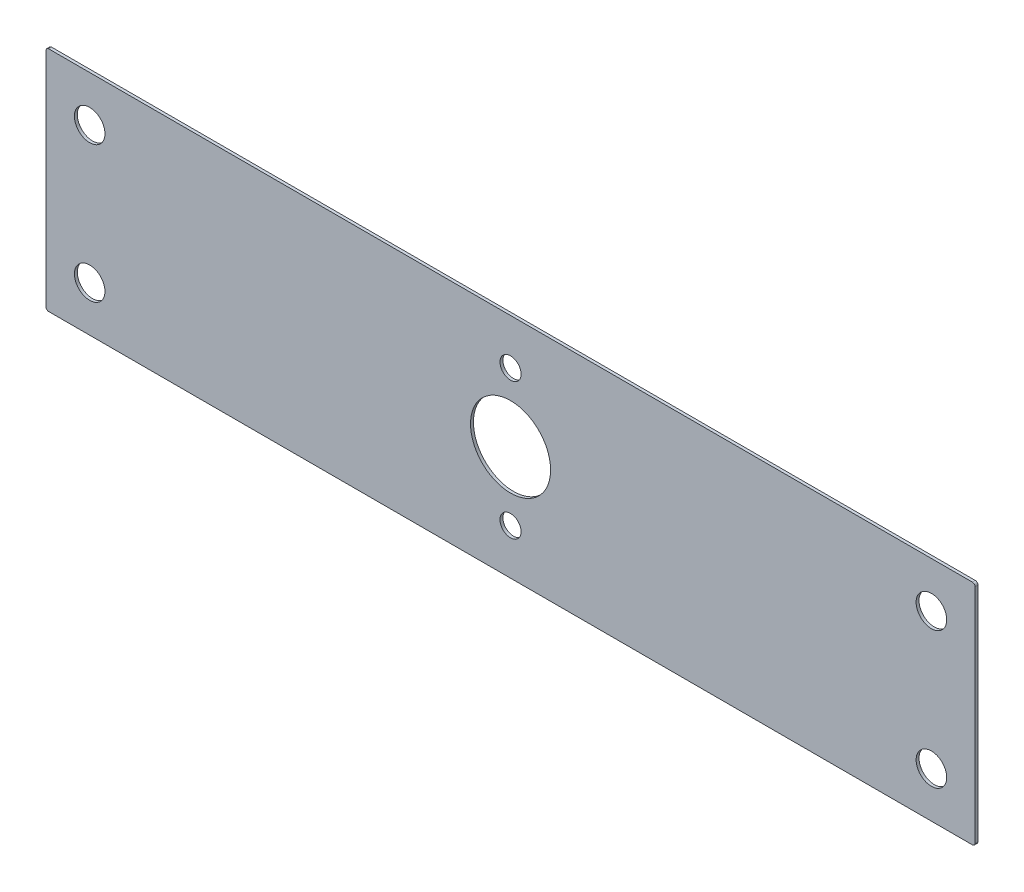
ISO-10303-21;
HEADER;
FILE_DESCRIPTION(('STEP AP214'),'2;1');
FILE_NAME('part.step','',(''),(''),'','','');
FILE_SCHEMA(('AUTOMOTIVE_DESIGN { 1 0 10303 214 1 1 1 1 }'));
ENDSEC;
DATA;
#1=APPLICATION_CONTEXT('core data for automotive mechanical design processes');
#2=APPLICATION_PROTOCOL_DEFINITION('international standard','automotive_design',2000,#1);
#3=PRODUCT_CONTEXT('',#1,'mechanical');
#4=PRODUCT('Part','Part','',(#3));
#5=PRODUCT_RELATED_PRODUCT_CATEGORY('part','',(#4));
#6=PRODUCT_DEFINITION_FORMATION('','',#4);
#7=PRODUCT_DEFINITION_CONTEXT('part definition',#1,'design');
#8=PRODUCT_DEFINITION('design','',#6,#7);
#9=PRODUCT_DEFINITION_SHAPE('','',#8);
#10=(LENGTH_UNIT() NAMED_UNIT(*) SI_UNIT(.MILLI.,.METRE.));
#11=(NAMED_UNIT(*) PLANE_ANGLE_UNIT() SI_UNIT($,.RADIAN.));
#12=(NAMED_UNIT(*) SI_UNIT($,.STERADIAN.) SOLID_ANGLE_UNIT());
#13=UNCERTAINTY_MEASURE_WITH_UNIT(LENGTH_MEASURE(1.E-05),#10,'distance_accuracy_value','');
#14=(GEOMETRIC_REPRESENTATION_CONTEXT(3) GLOBAL_UNCERTAINTY_ASSIGNED_CONTEXT((#13)) GLOBAL_UNIT_ASSIGNED_CONTEXT((#10,
#11,#12)) REPRESENTATION_CONTEXT('',''));
#15=CARTESIAN_POINT('',(0.,0.,0.));
#16=DIRECTION('',(0.,0.,1.));
#17=DIRECTION('',(1.,0.,0.));
#18=AXIS2_PLACEMENT_3D('',#15,#16,#17);
#19=CARTESIAN_POINT('',(0.,0.,0.4064));
#20=DIRECTION('',(0.,0.,1.));
#21=DIRECTION('',(1.,0.,0.));
#22=AXIS2_PLACEMENT_3D('',#19,#20,#21);
#23=PLANE('',#22);
#24=CARTESIAN_POINT('',(-58.7248,9.525,0.4064));
#25=DIRECTION('',(0.,0.,1.));
#26=DIRECTION('',(1.,0.,0.));
#27=AXIS2_PLACEMENT_3D('',#24,#25,#26);
#28=CIRCLE('',#27,2.1336);
#29=CARTESIAN_POINT('',(-56.5912,9.525,0.4064));
#30=VERTEX_POINT('',#29);
#31=EDGE_CURVE('E409',#30,#30,#28,.T.);
#32=ORIENTED_EDGE('',*,*,#31,.F.);
#33=EDGE_LOOP('',(#32));
#34=FACE_BOUND('',#33,.T.);
#35=CARTESIAN_POINT('',(0.,9.525,0.4064));
#36=DIRECTION('',(0.,0.,1.));
#37=DIRECTION('',(1.,0.,0.));
#38=AXIS2_PLACEMENT_3D('',#35,#36,#37);
#39=CIRCLE('',#38,1.4732);
#40=CARTESIAN_POINT('',(1.4732,9.525,0.4064));
#41=VERTEX_POINT('',#40);
#42=EDGE_CURVE('E169',#41,#41,#39,.T.);
#43=ORIENTED_EDGE('',*,*,#42,.F.);
#44=EDGE_LOOP('',(#43));
#45=FACE_BOUND('',#44,.T.);
#46=CARTESIAN_POINT('',(58.7248,-9.525,0.4064));
#47=DIRECTION('',(0.,0.,1.));
#48=DIRECTION('',(1.,0.,0.));
#49=AXIS2_PLACEMENT_3D('',#46,#47,#48);
#50=CIRCLE('',#49,2.1336);
#51=CARTESIAN_POINT('',(60.8584,-9.525,0.4064));
#52=VERTEX_POINT('',#51);
#53=EDGE_CURVE('E188',#52,#52,#50,.T.);
#54=ORIENTED_EDGE('',*,*,#53,.F.);
#55=EDGE_LOOP('',(#54));
#56=FACE_BOUND('',#55,.T.);
#57=DIRECTION('',(-1.,0.,0.));
#58=VECTOR('',#57,1.);
#59=CARTESIAN_POINT('',(-64.8208,15.875,0.4064));
#60=LINE('',#59,#58);
#61=CARTESIAN_POINT('',(64.4398,15.875,0.4064));
#62=VERTEX_POINT('',#61);
#63=CARTESIAN_POINT('',(-64.4398,15.875,0.4064));
#64=VERTEX_POINT('',#63);
#65=EDGE_CURVE('E143',#62,#64,#60,.T.);
#66=ORIENTED_EDGE('',*,*,#65,.T.);
#67=CARTESIAN_POINT('',(-64.4398,15.494,0.4064));
#68=DIRECTION('',(0.,0.,1.));
#69=DIRECTION('',(1.,0.,0.));
#70=AXIS2_PLACEMENT_3D('',#67,#68,#69);
#71=CIRCLE('',#70,0.381);
#72=CARTESIAN_POINT('',(-64.8208,15.494,0.4064));
#73=VERTEX_POINT('',#72);
#74=EDGE_CURVE('E214',#64,#73,#71,.T.);
#75=ORIENTED_EDGE('',*,*,#74,.T.);
#76=DIRECTION('',(0.,-1.,0.));
#77=VECTOR('',#76,1.);
#78=CARTESIAN_POINT('',(-64.8208,15.875,0.4064));
#79=LINE('',#78,#77);
#80=CARTESIAN_POINT('',(-64.8208,-15.494,0.4064));
#81=VERTEX_POINT('',#80);
#82=EDGE_CURVE('E125',#73,#81,#79,.T.);
#83=ORIENTED_EDGE('',*,*,#82,.T.);
#84=CARTESIAN_POINT('',(-64.4398,-15.494,0.4064));
#85=DIRECTION('',(0.,0.,1.));
#86=DIRECTION('',(1.,0.,0.));
#87=AXIS2_PLACEMENT_3D('',#84,#85,#86);
#88=CIRCLE('',#87,0.381);
#89=CARTESIAN_POINT('',(-64.4398,-15.875,0.4064));
#90=VERTEX_POINT('',#89);
#91=EDGE_CURVE('E212',#81,#90,#88,.T.);
#92=ORIENTED_EDGE('',*,*,#91,.T.);
#93=DIRECTION('',(1.,0.,0.));
#94=VECTOR('',#93,1.);
#95=CARTESIAN_POINT('',(-64.8208,-15.875,0.4064));
#96=LINE('',#95,#94);
#97=CARTESIAN_POINT('',(64.4398,-15.875,0.4064));
#98=VERTEX_POINT('',#97);
#99=EDGE_CURVE('E206',#90,#98,#96,.T.);
#100=ORIENTED_EDGE('',*,*,#99,.T.);
#101=CARTESIAN_POINT('',(64.4398,-15.494,0.4064));
#102=DIRECTION('',(0.,0.,1.));
#103=DIRECTION('',(1.,0.,0.));
#104=AXIS2_PLACEMENT_3D('',#101,#102,#103);
#105=CIRCLE('',#104,0.381);
#106=CARTESIAN_POINT('',(64.8208,-15.494,0.4064));
#107=VERTEX_POINT('',#106);
#108=EDGE_CURVE('E60',#98,#107,#105,.T.);
#109=ORIENTED_EDGE('',*,*,#108,.T.);
#110=DIRECTION('',(0.,1.,0.));
#111=VECTOR('',#110,1.);
#112=CARTESIAN_POINT('',(64.8208,15.875,0.4064));
#113=LINE('',#112,#111);
#114=CARTESIAN_POINT('',(64.8208,15.494,0.4064));
#115=VERTEX_POINT('',#114);
#116=EDGE_CURVE('E233',#107,#115,#113,.T.);
#117=ORIENTED_EDGE('',*,*,#116,.T.);
#118=CARTESIAN_POINT('',(64.4398,15.494,0.4064));
#119=DIRECTION('',(0.,0.,1.));
#120=DIRECTION('',(1.,0.,0.));
#121=AXIS2_PLACEMENT_3D('',#118,#119,#120);
#122=CIRCLE('',#121,0.381);
#123=EDGE_CURVE('E158',#115,#62,#122,.T.);
#124=ORIENTED_EDGE('',*,*,#123,.T.);
#125=EDGE_LOOP('',(#66,#75,#83,#92,#100,#109,#117,#124));
#126=FACE_BOUND('',#125,.T.);
#127=CARTESIAN_POINT('',(58.7248,9.525,0.4064));
#128=DIRECTION('',(0.,0.,1.));
#129=DIRECTION('',(1.,0.,0.));
#130=AXIS2_PLACEMENT_3D('',#127,#128,#129);
#131=CIRCLE('',#130,2.1336);
#132=CARTESIAN_POINT('',(60.8584,9.525,0.4064));
#133=VERTEX_POINT('',#132);
#134=EDGE_CURVE('E133',#133,#133,#131,.T.);
#135=ORIENTED_EDGE('',*,*,#134,.F.);
#136=EDGE_LOOP('',(#135));
#137=FACE_BOUND('',#136,.T.);
#138=CARTESIAN_POINT('',(0.,0.,0.4064));
#139=DIRECTION('',(0.,0.,1.));
#140=DIRECTION('',(1.,0.,0.));
#141=AXIS2_PLACEMENT_3D('',#138,#139,#140);
#142=CIRCLE('',#141,5.588);
#143=CARTESIAN_POINT('',(5.588,0.,0.4064));
#144=VERTEX_POINT('',#143);
#145=EDGE_CURVE('E180',#144,#144,#142,.T.);
#146=ORIENTED_EDGE('',*,*,#145,.F.);
#147=EDGE_LOOP('',(#146));
#148=FACE_BOUND('',#147,.T.);
#149=CARTESIAN_POINT('',(0.,-9.525,0.4064));
#150=DIRECTION('',(0.,0.,1.));
#151=DIRECTION('',(1.,0.,0.));
#152=AXIS2_PLACEMENT_3D('',#149,#150,#151);
#153=CIRCLE('',#152,1.4732);
#154=CARTESIAN_POINT('',(1.4732,-9.525,0.4064));
#155=VERTEX_POINT('',#154);
#156=EDGE_CURVE('E179',#155,#155,#153,.T.);
#157=ORIENTED_EDGE('',*,*,#156,.F.);
#158=EDGE_LOOP('',(#157));
#159=FACE_BOUND('',#158,.T.);
#160=CARTESIAN_POINT('',(-58.7248,-9.525,0.4064));
#161=DIRECTION('',(0.,0.,1.));
#162=DIRECTION('',(1.,0.,0.));
#163=AXIS2_PLACEMENT_3D('',#160,#161,#162);
#164=CIRCLE('',#163,2.1336);
#165=CARTESIAN_POINT('',(-56.5912,-9.525,0.4064));
#166=VERTEX_POINT('',#165);
#167=EDGE_CURVE('E416',#166,#166,#164,.T.);
#168=ORIENTED_EDGE('',*,*,#167,.F.);
#169=EDGE_LOOP('',(#168));
#170=FACE_BOUND('',#169,.T.);
#171=ADVANCED_FACE('F39',(#34,#45,#56,#126,#137,#148,#159,#170),#23,.T.);
#172=CARTESIAN_POINT('',(0.,0.,0.));
#173=DIRECTION('',(0.,0.,1.));
#174=DIRECTION('',(1.,0.,0.));
#175=AXIS2_PLACEMENT_3D('',#172,#173,#174);
#176=PLANE('',#175);
#177=CARTESIAN_POINT('',(-58.7248,9.525,0.));
#178=DIRECTION('',(0.,0.,1.));
#179=DIRECTION('',(1.,0.,0.));
#180=AXIS2_PLACEMENT_3D('',#177,#178,#179);
#181=CIRCLE('',#180,2.1336);
#182=CARTESIAN_POINT('',(-56.5912,9.525,0.));
#183=VERTEX_POINT('',#182);
#184=EDGE_CURVE('E412',#183,#183,#181,.T.);
#185=ORIENTED_EDGE('',*,*,#184,.T.);
#186=EDGE_LOOP('',(#185));
#187=FACE_BOUND('',#186,.T.);
#188=CARTESIAN_POINT('',(0.,9.525,0.));
#189=DIRECTION('',(0.,0.,1.));
#190=DIRECTION('',(1.,0.,0.));
#191=AXIS2_PLACEMENT_3D('',#188,#189,#190);
#192=CIRCLE('',#191,1.4732);
#193=CARTESIAN_POINT('',(1.4732,9.525,0.));
#194=VERTEX_POINT('',#193);
#195=EDGE_CURVE('E176',#194,#194,#192,.T.);
#196=ORIENTED_EDGE('',*,*,#195,.T.);
#197=EDGE_LOOP('',(#196));
#198=FACE_BOUND('',#197,.T.);
#199=CARTESIAN_POINT('',(58.7248,-9.525,0.));
#200=DIRECTION('',(0.,0.,1.));
#201=DIRECTION('',(1.,0.,0.));
#202=AXIS2_PLACEMENT_3D('',#199,#200,#201);
#203=CIRCLE('',#202,2.1336);
#204=CARTESIAN_POINT('',(60.8584,-9.525,0.));
#205=VERTEX_POINT('',#204);
#206=EDGE_CURVE('E185',#205,#205,#203,.T.);
#207=ORIENTED_EDGE('',*,*,#206,.T.);
#208=EDGE_LOOP('',(#207));
#209=FACE_BOUND('',#208,.T.);
#210=DIRECTION('',(0.,-1.,0.));
#211=VECTOR('',#210,1.);
#212=CARTESIAN_POINT('',(-64.8208,15.875,0.));
#213=LINE('',#212,#211);
#214=CARTESIAN_POINT('',(-64.8208,15.494,0.));
#215=VERTEX_POINT('',#214);
#216=CARTESIAN_POINT('',(-64.8208,-15.494,0.));
#217=VERTEX_POINT('',#216);
#218=EDGE_CURVE('E122',#215,#217,#213,.T.);
#219=ORIENTED_EDGE('',*,*,#218,.F.);
#220=CARTESIAN_POINT('',(-64.4398,15.494,0.));
#221=DIRECTION('',(0.,0.,1.));
#222=DIRECTION('',(1.,0.,0.));
#223=AXIS2_PLACEMENT_3D('',#220,#221,#222);
#224=CIRCLE('',#223,0.381);
#225=CARTESIAN_POINT('',(-64.4398,15.875,0.));
#226=VERTEX_POINT('',#225);
#227=EDGE_CURVE('E105',#215,#226,#224,.F.);
#228=ORIENTED_EDGE('',*,*,#227,.T.);
#229=DIRECTION('',(-1.,0.,0.));
#230=VECTOR('',#229,1.);
#231=CARTESIAN_POINT('',(-64.8208,15.875,0.));
#232=LINE('',#231,#230);
#233=CARTESIAN_POINT('',(64.4398,15.875,0.));
#234=VERTEX_POINT('',#233);
#235=EDGE_CURVE('E148',#234,#226,#232,.T.);
#236=ORIENTED_EDGE('',*,*,#235,.F.);
#237=CARTESIAN_POINT('',(64.4398,15.494,0.));
#238=DIRECTION('',(0.,0.,1.));
#239=DIRECTION('',(1.,0.,0.));
#240=AXIS2_PLACEMENT_3D('',#237,#238,#239);
#241=CIRCLE('',#240,0.381);
#242=CARTESIAN_POINT('',(64.8208,15.494,0.));
#243=VERTEX_POINT('',#242);
#244=EDGE_CURVE('E126',#234,#243,#241,.F.);
#245=ORIENTED_EDGE('',*,*,#244,.T.);
#246=DIRECTION('',(0.,1.,0.));
#247=VECTOR('',#246,1.);
#248=CARTESIAN_POINT('',(64.8208,15.875,0.));
#249=LINE('',#248,#247);
#250=CARTESIAN_POINT('',(64.8208,-15.494,0.));
#251=VERTEX_POINT('',#250);
#252=EDGE_CURVE('E136',#251,#243,#249,.T.);
#253=ORIENTED_EDGE('',*,*,#252,.F.);
#254=CARTESIAN_POINT('',(64.4398,-15.494,0.));
#255=DIRECTION('',(0.,0.,1.));
#256=DIRECTION('',(1.,0.,0.));
#257=AXIS2_PLACEMENT_3D('',#254,#255,#256);
#258=CIRCLE('',#257,0.381);
#259=CARTESIAN_POINT('',(64.4398,-15.875,0.));
#260=VERTEX_POINT('',#259);
#261=EDGE_CURVE('E152',#251,#260,#258,.F.);
#262=ORIENTED_EDGE('',*,*,#261,.T.);
#263=DIRECTION('',(1.,0.,0.));
#264=VECTOR('',#263,1.);
#265=CARTESIAN_POINT('',(-64.8208,-15.875,0.));
#266=LINE('',#265,#264);
#267=CARTESIAN_POINT('',(-64.4398,-15.875,0.));
#268=VERTEX_POINT('',#267);
#269=EDGE_CURVE('E132',#268,#260,#266,.T.);
#270=ORIENTED_EDGE('',*,*,#269,.F.);
#271=CARTESIAN_POINT('',(-64.4398,-15.494,0.));
#272=DIRECTION('',(0.,0.,1.));
#273=DIRECTION('',(1.,0.,0.));
#274=AXIS2_PLACEMENT_3D('',#271,#272,#273);
#275=CIRCLE('',#274,0.381);
#276=EDGE_CURVE('E116',#268,#217,#275,.F.);
#277=ORIENTED_EDGE('',*,*,#276,.T.);
#278=EDGE_LOOP('',(#219,#228,#236,#245,#253,#262,#270,#277));
#279=FACE_BOUND('',#278,.T.);
#280=CARTESIAN_POINT('',(58.7248,9.525,0.));
#281=DIRECTION('',(0.,0.,1.));
#282=DIRECTION('',(1.,0.,0.));
#283=AXIS2_PLACEMENT_3D('',#280,#281,#282);
#284=CIRCLE('',#283,2.1336);
#285=CARTESIAN_POINT('',(60.8584,9.525,0.));
#286=VERTEX_POINT('',#285);
#287=EDGE_CURVE('E140',#286,#286,#284,.T.);
#288=ORIENTED_EDGE('',*,*,#287,.T.);
#289=EDGE_LOOP('',(#288));
#290=FACE_BOUND('',#289,.T.);
#291=CARTESIAN_POINT('',(0.,0.,0.));
#292=DIRECTION('',(0.,0.,1.));
#293=DIRECTION('',(1.,0.,0.));
#294=AXIS2_PLACEMENT_3D('',#291,#292,#293);
#295=CIRCLE('',#294,5.588);
#296=CARTESIAN_POINT('',(5.588,0.,0.));
#297=VERTEX_POINT('',#296);
#298=EDGE_CURVE('E175',#297,#297,#295,.T.);
#299=ORIENTED_EDGE('',*,*,#298,.T.);
#300=EDGE_LOOP('',(#299));
#301=FACE_BOUND('',#300,.T.);
#302=CARTESIAN_POINT('',(0.,-9.525,0.));
#303=DIRECTION('',(0.,0.,1.));
#304=DIRECTION('',(1.,0.,0.));
#305=AXIS2_PLACEMENT_3D('',#302,#303,#304);
#306=CIRCLE('',#305,1.4732);
#307=CARTESIAN_POINT('',(1.4732,-9.525,0.));
#308=VERTEX_POINT('',#307);
#309=EDGE_CURVE('E177',#308,#308,#306,.T.);
#310=ORIENTED_EDGE('',*,*,#309,.T.);
#311=EDGE_LOOP('',(#310));
#312=FACE_BOUND('',#311,.T.);
#313=CARTESIAN_POINT('',(-58.7248,-9.525,0.));
#314=DIRECTION('',(0.,0.,1.));
#315=DIRECTION('',(1.,0.,0.));
#316=AXIS2_PLACEMENT_3D('',#313,#314,#315);
#317=CIRCLE('',#316,2.1336);
#318=CARTESIAN_POINT('',(-56.5912,-9.525,0.));
#319=VERTEX_POINT('',#318);
#320=EDGE_CURVE('E420',#319,#319,#317,.T.);
#321=ORIENTED_EDGE('',*,*,#320,.T.);
#322=EDGE_LOOP('',(#321));
#323=FACE_BOUND('',#322,.T.);
#324=ADVANCED_FACE('F129',(#187,#198,#209,#279,#290,#301,#312,#323),#176,.F.);
#325=CARTESIAN_POINT('',(-64.8208,15.875,0.4064));
#326=DIRECTION('',(1.,0.,0.));
#327=DIRECTION('',(0.,0.,-1.));
#328=AXIS2_PLACEMENT_3D('',#325,#326,#327);
#329=PLANE('',#328);
#330=ORIENTED_EDGE('',*,*,#82,.F.);
#331=DIRECTION('',(0.,0.,-1.));
#332=VECTOR('',#331,1.);
#333=CARTESIAN_POINT('',(-64.8208,15.494,0.4064));
#334=LINE('',#333,#332);
#335=EDGE_CURVE('E109',#73,#215,#334,.T.);
#336=ORIENTED_EDGE('',*,*,#335,.T.);
#337=ORIENTED_EDGE('',*,*,#218,.T.);
#338=DIRECTION('',(0.,0.,-1.));
#339=VECTOR('',#338,1.);
#340=CARTESIAN_POINT('',(-64.8208,-15.494,0.4064));
#341=LINE('',#340,#339);
#342=EDGE_CURVE('E127',#217,#81,#341,.F.);
#343=ORIENTED_EDGE('',*,*,#342,.T.);
#344=EDGE_LOOP('',(#330,#336,#337,#343));
#345=FACE_BOUND('',#344,.T.);
#346=ADVANCED_FACE('F121',(#345),#329,.F.);
#347=CARTESIAN_POINT('',(-64.8208,-15.875,0.4064));
#348=DIRECTION('',(0.,1.,0.));
#349=DIRECTION('',(0.,0.,1.));
#350=AXIS2_PLACEMENT_3D('',#347,#348,#349);
#351=PLANE('',#350);
#352=ORIENTED_EDGE('',*,*,#99,.F.);
#353=DIRECTION('',(0.,0.,-1.));
#354=VECTOR('',#353,1.);
#355=CARTESIAN_POINT('',(-64.4398,-15.875,0.4064));
#356=LINE('',#355,#354);
#357=EDGE_CURVE('E219',#90,#268,#356,.T.);
#358=ORIENTED_EDGE('',*,*,#357,.T.);
#359=ORIENTED_EDGE('',*,*,#269,.T.);
#360=DIRECTION('',(0.,0.,-1.));
#361=VECTOR('',#360,1.);
#362=CARTESIAN_POINT('',(64.4398,-15.875,0.4064));
#363=LINE('',#362,#361);
#364=EDGE_CURVE('E217',#260,#98,#363,.F.);
#365=ORIENTED_EDGE('',*,*,#364,.T.);
#366=EDGE_LOOP('',(#352,#358,#359,#365));
#367=FACE_BOUND('',#366,.T.);
#368=ADVANCED_FACE('F224',(#367),#351,.F.);
#369=CARTESIAN_POINT('',(64.8208,15.875,0.4064));
#370=DIRECTION('',(-1.,0.,0.));
#371=DIRECTION('',(0.,0.,1.));
#372=AXIS2_PLACEMENT_3D('',#369,#370,#371);
#373=PLANE('',#372);
#374=ORIENTED_EDGE('',*,*,#116,.F.);
#375=DIRECTION('',(0.,0.,-1.));
#376=VECTOR('',#375,1.);
#377=CARTESIAN_POINT('',(64.8208,-15.494,0.4064));
#378=LINE('',#377,#376);
#379=EDGE_CURVE('E12',#107,#251,#378,.T.);
#380=ORIENTED_EDGE('',*,*,#379,.T.);
#381=ORIENTED_EDGE('',*,*,#252,.T.);
#382=DIRECTION('',(0.,0.,-1.));
#383=VECTOR('',#382,1.);
#384=CARTESIAN_POINT('',(64.8208,15.494,0.4064));
#385=LINE('',#384,#383);
#386=EDGE_CURVE('E47',#243,#115,#385,.F.);
#387=ORIENTED_EDGE('',*,*,#386,.T.);
#388=EDGE_LOOP('',(#374,#380,#381,#387));
#389=FACE_BOUND('',#388,.T.);
#390=ADVANCED_FACE('F232',(#389),#373,.F.);
#391=CARTESIAN_POINT('',(-64.8208,15.875,0.4064));
#392=DIRECTION('',(0.,-1.,0.));
#393=DIRECTION('',(0.,0.,-1.));
#394=AXIS2_PLACEMENT_3D('',#391,#392,#393);
#395=PLANE('',#394);
#396=ORIENTED_EDGE('',*,*,#235,.T.);
#397=DIRECTION('',(0.,0.,-1.));
#398=VECTOR('',#397,1.);
#399=CARTESIAN_POINT('',(-64.4398,15.875,0.4064));
#400=LINE('',#399,#398);
#401=EDGE_CURVE('E110',#226,#64,#400,.F.);
#402=ORIENTED_EDGE('',*,*,#401,.T.);
#403=ORIENTED_EDGE('',*,*,#65,.F.);
#404=DIRECTION('',(0.,0.,-1.));
#405=VECTOR('',#404,1.);
#406=CARTESIAN_POINT('',(64.4398,15.875,0.4064));
#407=LINE('',#406,#405);
#408=EDGE_CURVE('E115',#62,#234,#407,.T.);
#409=ORIENTED_EDGE('',*,*,#408,.T.);
#410=EDGE_LOOP('',(#396,#402,#403,#409));
#411=FACE_BOUND('',#410,.T.);
#412=ADVANCED_FACE('F262',(#411),#395,.F.);
#413=CARTESIAN_POINT('',(58.7248,9.525,0.4064));
#414=DIRECTION('',(0.,0.,-1.));
#415=DIRECTION('',(-1.,0.,0.));
#416=AXIS2_PLACEMENT_3D('',#413,#414,#415);
#417=CYLINDRICAL_SURFACE('',#416,2.1336);
#418=ORIENTED_EDGE('',*,*,#134,.T.);
#419=EDGE_LOOP('',(#418));
#420=FACE_BOUND('',#419,.T.);
#421=ORIENTED_EDGE('',*,*,#287,.F.);
#422=EDGE_LOOP('',(#421));
#423=FACE_BOUND('',#422,.T.);
#424=ADVANCED_FACE('F259',(#420,#423),#417,.F.);
#425=CARTESIAN_POINT('',(58.7248,-9.525,0.4064));
#426=DIRECTION('',(0.,0.,-1.));
#427=DIRECTION('',(-1.,0.,0.));
#428=AXIS2_PLACEMENT_3D('',#425,#426,#427);
#429=CYLINDRICAL_SURFACE('',#428,2.1336);
#430=ORIENTED_EDGE('',*,*,#53,.T.);
#431=EDGE_LOOP('',(#430));
#432=FACE_BOUND('',#431,.T.);
#433=ORIENTED_EDGE('',*,*,#206,.F.);
#434=EDGE_LOOP('',(#433));
#435=FACE_BOUND('',#434,.T.);
#436=ADVANCED_FACE('F294',(#432,#435),#429,.F.);
#437=CARTESIAN_POINT('',(0.,0.,0.4064));
#438=DIRECTION('',(0.,0.,-1.));
#439=DIRECTION('',(-1.,0.,0.));
#440=AXIS2_PLACEMENT_3D('',#437,#438,#439);
#441=CYLINDRICAL_SURFACE('',#440,5.588);
#442=ORIENTED_EDGE('',*,*,#145,.T.);
#443=EDGE_LOOP('',(#442));
#444=FACE_BOUND('',#443,.T.);
#445=ORIENTED_EDGE('',*,*,#298,.F.);
#446=EDGE_LOOP('',(#445));
#447=FACE_BOUND('',#446,.T.);
#448=ADVANCED_FACE('F301',(#444,#447),#441,.F.);
#449=CARTESIAN_POINT('',(0.,9.525,0.4064));
#450=DIRECTION('',(0.,0.,-1.));
#451=DIRECTION('',(-1.,0.,0.));
#452=AXIS2_PLACEMENT_3D('',#449,#450,#451);
#453=CYLINDRICAL_SURFACE('',#452,1.4732);
#454=ORIENTED_EDGE('',*,*,#42,.T.);
#455=EDGE_LOOP('',(#454));
#456=FACE_BOUND('',#455,.T.);
#457=ORIENTED_EDGE('',*,*,#195,.F.);
#458=EDGE_LOOP('',(#457));
#459=FACE_BOUND('',#458,.T.);
#460=ADVANCED_FACE('F308',(#456,#459),#453,.F.);
#461=CARTESIAN_POINT('',(0.,-9.525,0.4064));
#462=DIRECTION('',(0.,0.,-1.));
#463=DIRECTION('',(-1.,0.,0.));
#464=AXIS2_PLACEMENT_3D('',#461,#462,#463);
#465=CYLINDRICAL_SURFACE('',#464,1.4732);
#466=ORIENTED_EDGE('',*,*,#156,.T.);
#467=EDGE_LOOP('',(#466));
#468=FACE_BOUND('',#467,.T.);
#469=ORIENTED_EDGE('',*,*,#309,.F.);
#470=EDGE_LOOP('',(#469));
#471=FACE_BOUND('',#470,.T.);
#472=ADVANCED_FACE('F316',(#468,#471),#465,.F.);
#473=CARTESIAN_POINT('',(-58.7248,9.525,0.4064));
#474=DIRECTION('',(0.,0.,-1.));
#475=DIRECTION('',(-1.,0.,0.));
#476=AXIS2_PLACEMENT_3D('',#473,#474,#475);
#477=CYLINDRICAL_SURFACE('',#476,2.1336);
#478=ORIENTED_EDGE('',*,*,#31,.T.);
#479=EDGE_LOOP('',(#478));
#480=FACE_BOUND('',#479,.T.);
#481=ORIENTED_EDGE('',*,*,#184,.F.);
#482=EDGE_LOOP('',(#481));
#483=FACE_BOUND('',#482,.T.);
#484=ADVANCED_FACE('F324',(#480,#483),#477,.F.);
#485=CARTESIAN_POINT('',(-58.7248,-9.525,0.4064));
#486=DIRECTION('',(0.,0.,-1.));
#487=DIRECTION('',(-1.,0.,0.));
#488=AXIS2_PLACEMENT_3D('',#485,#486,#487);
#489=CYLINDRICAL_SURFACE('',#488,2.1336);
#490=ORIENTED_EDGE('',*,*,#167,.T.);
#491=EDGE_LOOP('',(#490));
#492=FACE_BOUND('',#491,.T.);
#493=ORIENTED_EDGE('',*,*,#320,.F.);
#494=EDGE_LOOP('',(#493));
#495=FACE_BOUND('',#494,.T.);
#496=ADVANCED_FACE('F246',(#492,#495),#489,.F.);
#497=CARTESIAN_POINT('',(-64.4398,15.494,0.4064));
#498=DIRECTION('',(0.,0.,-1.));
#499=DIRECTION('',(-1.,0.,0.));
#500=AXIS2_PLACEMENT_3D('',#497,#498,#499);
#501=CYLINDRICAL_SURFACE('',#500,0.381);
#502=ORIENTED_EDGE('',*,*,#74,.F.);
#503=ORIENTED_EDGE('',*,*,#401,.F.);
#504=ORIENTED_EDGE('',*,*,#227,.F.);
#505=ORIENTED_EDGE('',*,*,#335,.F.);
#506=EDGE_LOOP('',(#502,#503,#504,#505));
#507=FACE_BOUND('',#506,.T.);
#508=ADVANCED_FACE('F108',(#507),#501,.T.);
#509=CARTESIAN_POINT('',(-64.4398,-15.494,0.4064));
#510=DIRECTION('',(0.,0.,-1.));
#511=DIRECTION('',(-1.,0.,0.));
#512=AXIS2_PLACEMENT_3D('',#509,#510,#511);
#513=CYLINDRICAL_SURFACE('',#512,0.381);
#514=ORIENTED_EDGE('',*,*,#91,.F.);
#515=ORIENTED_EDGE('',*,*,#342,.F.);
#516=ORIENTED_EDGE('',*,*,#276,.F.);
#517=ORIENTED_EDGE('',*,*,#357,.F.);
#518=EDGE_LOOP('',(#514,#515,#516,#517));
#519=FACE_BOUND('',#518,.T.);
#520=ADVANCED_FACE('F239',(#519),#513,.T.);
#521=CARTESIAN_POINT('',(64.4398,-15.494,0.4064));
#522=DIRECTION('',(0.,0.,-1.));
#523=DIRECTION('',(-1.,0.,0.));
#524=AXIS2_PLACEMENT_3D('',#521,#522,#523);
#525=CYLINDRICAL_SURFACE('',#524,0.381);
#526=ORIENTED_EDGE('',*,*,#108,.F.);
#527=ORIENTED_EDGE('',*,*,#364,.F.);
#528=ORIENTED_EDGE('',*,*,#261,.F.);
#529=ORIENTED_EDGE('',*,*,#379,.F.);
#530=EDGE_LOOP('',(#526,#527,#528,#529));
#531=FACE_BOUND('',#530,.T.);
#532=ADVANCED_FACE('F231',(#531),#525,.T.);
#533=CARTESIAN_POINT('',(64.4398,15.494,0.4064));
#534=DIRECTION('',(0.,0.,-1.));
#535=DIRECTION('',(-1.,0.,0.));
#536=AXIS2_PLACEMENT_3D('',#533,#534,#535);
#537=CYLINDRICAL_SURFACE('',#536,0.381);
#538=ORIENTED_EDGE('',*,*,#123,.F.);
#539=ORIENTED_EDGE('',*,*,#386,.F.);
#540=ORIENTED_EDGE('',*,*,#244,.F.);
#541=ORIENTED_EDGE('',*,*,#408,.F.);
#542=EDGE_LOOP('',(#538,#539,#540,#541));
#543=FACE_BOUND('',#542,.T.);
#544=ADVANCED_FACE('F41',(#543),#537,.T.);
#545=CLOSED_SHELL('',(#171,#324,#346,#368,#390,#412,#424,#436,#448,#460,#472,#484,#496,#508,
#520,#532,#544));
#546=MANIFOLD_SOLID_BREP('B2',#545);
#547=ADVANCED_BREP_SHAPE_REPRESENTATION('',(#18,#546),#14);
#548=SHAPE_DEFINITION_REPRESENTATION(#9,#547);
ENDSEC;
END-ISO-10303-21;
